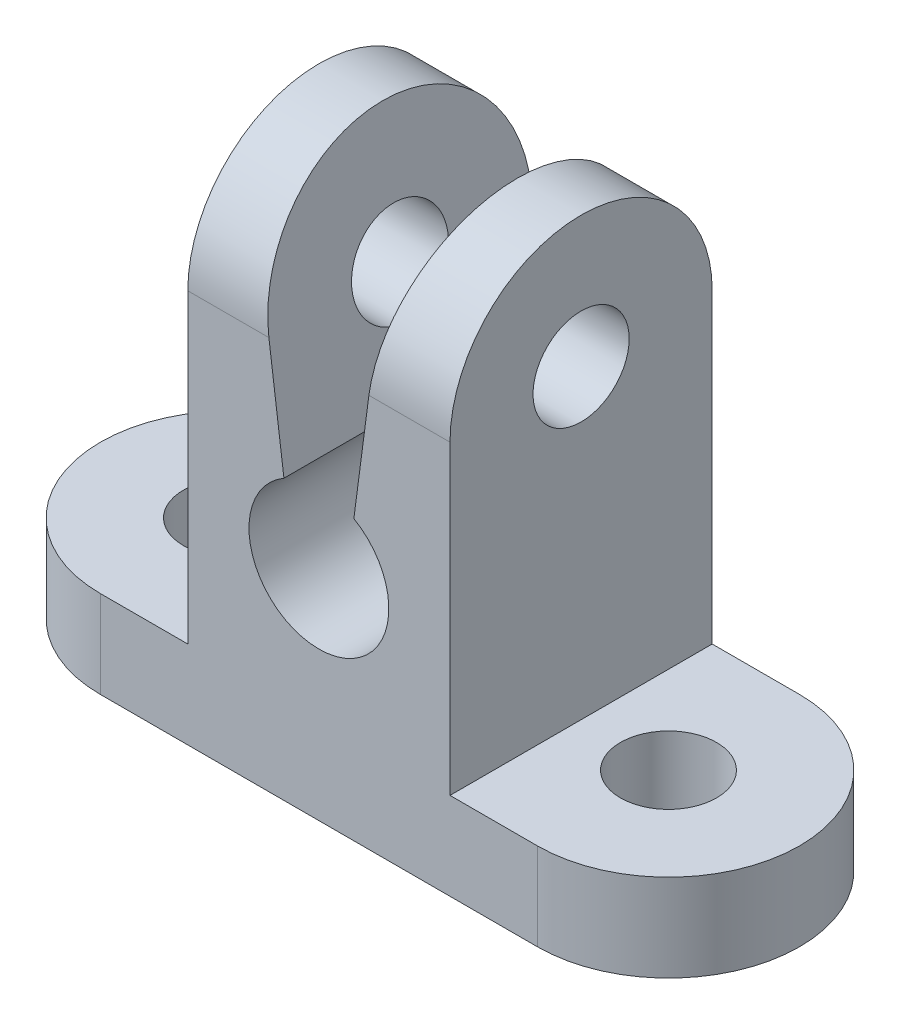
ISO-10303-21;
HEADER;
FILE_DESCRIPTION(('STEP AP214'),'2;1');
FILE_NAME('part.step','',(''),(''),'','','');
FILE_SCHEMA(('AUTOMOTIVE_DESIGN { 1 0 10303 214 1 1 1 1 }'));
ENDSEC;
DATA;
#1=APPLICATION_CONTEXT('core data for automotive mechanical design processes');
#2=APPLICATION_PROTOCOL_DEFINITION('international standard','automotive_design',2000,#1);
#3=PRODUCT_CONTEXT('',#1,'mechanical');
#4=PRODUCT('Part','Part','',(#3));
#5=PRODUCT_RELATED_PRODUCT_CATEGORY('part','',(#4));
#6=PRODUCT_DEFINITION_FORMATION('','',#4);
#7=PRODUCT_DEFINITION_CONTEXT('part definition',#1,'design');
#8=PRODUCT_DEFINITION('design','',#6,#7);
#9=PRODUCT_DEFINITION_SHAPE('','',#8);
#10=(LENGTH_UNIT() NAMED_UNIT(*) SI_UNIT(.MILLI.,.METRE.));
#11=(NAMED_UNIT(*) PLANE_ANGLE_UNIT() SI_UNIT($,.RADIAN.));
#12=(NAMED_UNIT(*) SI_UNIT($,.STERADIAN.) SOLID_ANGLE_UNIT());
#13=UNCERTAINTY_MEASURE_WITH_UNIT(LENGTH_MEASURE(1.E-05),#10,'distance_accuracy_value','');
#14=(GEOMETRIC_REPRESENTATION_CONTEXT(3) GLOBAL_UNCERTAINTY_ASSIGNED_CONTEXT((#13)) GLOBAL_UNIT_ASSIGNED_CONTEXT((#10,
#11,#12)) REPRESENTATION_CONTEXT('',''));
#15=CARTESIAN_POINT('',(0.,0.,0.));
#16=DIRECTION('',(0.,0.,1.));
#17=DIRECTION('',(1.,0.,0.));
#18=AXIS2_PLACEMENT_3D('',#15,#16,#17);
#19=CARTESIAN_POINT('',(-3.,9.,0.));
#20=DIRECTION('',(-1.,0.,0.));
#21=DIRECTION('',(0.,0.,1.));
#22=AXIS2_PLACEMENT_3D('',#19,#20,#21);
#23=CYLINDRICAL_SURFACE('',#22,3.);
#24=DIRECTION('',(-1.,0.,0.));
#25=VECTOR('',#24,1.);
#26=CARTESIAN_POINT('',(-5.,9.,-3.));
#27=LINE('',#26,#25);
#28=CARTESIAN_POINT('',(1.14418693853782,9.,-3.));
#29=VERTEX_POINT('',#28);
#30=CARTESIAN_POINT('',(3.,9.,-3.));
#31=VERTEX_POINT('',#30);
#32=EDGE_CURVE('E214',#29,#31,#27,.F.);
#33=ORIENTED_EDGE('',*,*,#32,.F.);
#34=CARTESIAN_POINT('',(1.14418693853782,9.,0.));
#35=DIRECTION('',(-0.99144486137381,0.130526192220053,0.));
#36=DIRECTION('',(-0.130526192220053,-0.99144486137381,0.));
#37=AXIS2_PLACEMENT_3D('',#34,#35,#36);
#38=ELLIPSE('',#37,3.02588688174046,3.);
#39=CARTESIAN_POINT('',(1.14418693853782,9.,3.));
#40=VERTEX_POINT('',#39);
#41=EDGE_CURVE('E141',#29,#40,#38,.F.);
#42=ORIENTED_EDGE('',*,*,#41,.T.);
#43=DIRECTION('',(-1.,0.,0.));
#44=VECTOR('',#43,1.);
#45=CARTESIAN_POINT('',(-5.,9.,3.));
#46=LINE('',#45,#44);
#47=CARTESIAN_POINT('',(3.,9.,3.));
#48=VERTEX_POINT('',#47);
#49=EDGE_CURVE('E217',#48,#40,#46,.T.);
#50=ORIENTED_EDGE('',*,*,#49,.F.);
#51=CARTESIAN_POINT('',(3.,9.,0.));
#52=DIRECTION('',(-1.,0.,0.));
#53=DIRECTION('',(0.,0.,1.));
#54=AXIS2_PLACEMENT_3D('',#51,#52,#53);
#55=CIRCLE('',#54,3.);
#56=EDGE_CURVE('E11',#31,#48,#55,.F.);
#57=ORIENTED_EDGE('',*,*,#56,.F.);
#58=EDGE_LOOP('',(#33,#42,#50,#57));
#59=FACE_BOUND('',#58,.T.);
#60=ADVANCED_FACE('F36',(#59),#23,.T.);
#61=CARTESIAN_POINT('',(-5.,2.,3.));
#62=DIRECTION('',(0.,0.,-1.));
#63=DIRECTION('',(-1.,0.,0.));
#64=AXIS2_PLACEMENT_3D('',#61,#62,#63);
#65=PLANE('',#64);
#66=DIRECTION('',(0.130526192220053,0.99144486137381,0.));
#67=VECTOR('',#66,1.);
#68=CARTESIAN_POINT('',(0.1336412341509,1.32414330980639,3.));
#69=LINE('',#68,#67);
#70=CARTESIAN_POINT('',(0.8,6.3856406460551,3.));
#71=VERTEX_POINT('',#70);
#72=EDGE_CURVE('E161',#71,#40,#69,.T.);
#73=ORIENTED_EDGE('',*,*,#72,.F.);
#74=CARTESIAN_POINT('',(0.,5.,3.));
#75=DIRECTION('',(0.,0.,-1.));
#76=DIRECTION('',(-1.,0.,0.));
#77=AXIS2_PLACEMENT_3D('',#74,#75,#76);
#78=CIRCLE('',#77,1.6);
#79=CARTESIAN_POINT('',(-0.8,6.3856406460551,3.));
#80=VERTEX_POINT('',#79);
#81=EDGE_CURVE('E131',#71,#80,#78,.T.);
#82=ORIENTED_EDGE('',*,*,#81,.T.);
#83=DIRECTION('',(-0.130526192220053,0.99144486137381,0.));
#84=VECTOR('',#83,1.);
#85=CARTESIAN_POINT('',(-0.304012102705562,2.618238535319,3.));
#86=LINE('',#85,#84);
#87=CARTESIAN_POINT('',(-1.14418693853782,9.,3.));
#88=VERTEX_POINT('',#87);
#89=EDGE_CURVE('E134',#80,#88,#86,.T.);
#90=ORIENTED_EDGE('',*,*,#89,.T.);
#91=CARTESIAN_POINT('',(-3.,9.,3.));
#92=VERTEX_POINT('',#91);
#93=EDGE_CURVE('E62',#88,#92,#46,.T.);
#94=ORIENTED_EDGE('',*,*,#93,.T.);
#95=DIRECTION('',(0.,-1.,0.));
#96=VECTOR('',#95,1.);
#97=CARTESIAN_POINT('',(-3.,0.,3.));
#98=LINE('',#97,#96);
#99=CARTESIAN_POINT('',(-3.,2.,3.));
#100=VERTEX_POINT('',#99);
#101=EDGE_CURVE('E165',#92,#100,#98,.T.);
#102=ORIENTED_EDGE('',*,*,#101,.T.);
#103=DIRECTION('',(1.,0.,0.));
#104=VECTOR('',#103,1.);
#105=CARTESIAN_POINT('',(-5.,2.,3.));
#106=LINE('',#105,#104);
#107=CARTESIAN_POINT('',(-5.,2.,3.));
#108=VERTEX_POINT('',#107);
#109=EDGE_CURVE('E187',#108,#100,#106,.T.);
#110=ORIENTED_EDGE('',*,*,#109,.F.);
#111=DIRECTION('',(0.,-1.,0.));
#112=VECTOR('',#111,1.);
#113=CARTESIAN_POINT('',(-5.,2.,3.));
#114=LINE('',#113,#112);
#115=CARTESIAN_POINT('',(-5.,0.,3.));
#116=VERTEX_POINT('',#115);
#117=EDGE_CURVE('E211',#108,#116,#114,.T.);
#118=ORIENTED_EDGE('',*,*,#117,.T.);
#119=DIRECTION('',(1.,0.,0.));
#120=VECTOR('',#119,1.);
#121=CARTESIAN_POINT('',(-5.,0.,3.));
#122=LINE('',#121,#120);
#123=CARTESIAN_POINT('',(5.,0.,3.));
#124=VERTEX_POINT('',#123);
#125=EDGE_CURVE('E198',#116,#124,#122,.T.);
#126=ORIENTED_EDGE('',*,*,#125,.T.);
#127=DIRECTION('',(0.,-1.,0.));
#128=VECTOR('',#127,1.);
#129=CARTESIAN_POINT('',(5.,2.,3.));
#130=LINE('',#129,#128);
#131=CARTESIAN_POINT('',(5.,2.,3.));
#132=VERTEX_POINT('',#131);
#133=EDGE_CURVE('E208',#132,#124,#130,.T.);
#134=ORIENTED_EDGE('',*,*,#133,.F.);
#135=CARTESIAN_POINT('',(3.,2.,3.));
#136=VERTEX_POINT('',#135);
#137=EDGE_CURVE('E185',#136,#132,#106,.T.);
#138=ORIENTED_EDGE('',*,*,#137,.F.);
#139=DIRECTION('',(0.,-1.,0.));
#140=VECTOR('',#139,1.);
#141=CARTESIAN_POINT('',(3.,0.,3.));
#142=LINE('',#141,#140);
#143=EDGE_CURVE('E166',#48,#136,#142,.T.);
#144=ORIENTED_EDGE('',*,*,#143,.F.);
#145=ORIENTED_EDGE('',*,*,#49,.T.);
#146=EDGE_LOOP('',(#73,#82,#90,#94,#102,#110,#118,#126,#134,#138,#144,#145));
#147=FACE_BOUND('',#146,.T.);
#148=ADVANCED_FACE('F263',(#147),#65,.F.);
#149=CARTESIAN_POINT('',(-5.,2.,-3.));
#150=DIRECTION('',(0.,0.,1.));
#151=DIRECTION('',(1.,0.,0.));
#152=AXIS2_PLACEMENT_3D('',#149,#150,#151);
#153=PLANE('',#152);
#154=DIRECTION('',(0.130526192220053,0.99144486137381,0.));
#155=VECTOR('',#154,1.);
#156=CARTESIAN_POINT('',(-0.0399923766742916,0.00526509627362644,-3.));
#157=LINE('',#156,#155);
#158=CARTESIAN_POINT('',(0.8,6.3856406460551,-3.));
#159=VERTEX_POINT('',#158);
#160=EDGE_CURVE('E138',#159,#29,#157,.T.);
#161=ORIENTED_EDGE('',*,*,#160,.T.);
#162=ORIENTED_EDGE('',*,*,#32,.T.);
#163=DIRECTION('',(0.,1.,0.));
#164=VECTOR('',#163,1.);
#165=CARTESIAN_POINT('',(3.,0.,-3.));
#166=LINE('',#165,#164);
#167=CARTESIAN_POINT('',(3.,2.,-3.));
#168=VERTEX_POINT('',#167);
#169=EDGE_CURVE('E168',#168,#31,#166,.T.);
#170=ORIENTED_EDGE('',*,*,#169,.F.);
#171=DIRECTION('',(-1.,0.,0.));
#172=VECTOR('',#171,1.);
#173=CARTESIAN_POINT('',(-5.,2.,-3.));
#174=LINE('',#173,#172);
#175=CARTESIAN_POINT('',(5.,2.,-3.));
#176=VERTEX_POINT('',#175);
#177=EDGE_CURVE('E193',#176,#168,#174,.T.);
#178=ORIENTED_EDGE('',*,*,#177,.F.);
#179=DIRECTION('',(0.,-1.,0.));
#180=VECTOR('',#179,1.);
#181=CARTESIAN_POINT('',(5.,2.,-3.));
#182=LINE('',#181,#180);
#183=CARTESIAN_POINT('',(5.,0.,-3.));
#184=VERTEX_POINT('',#183);
#185=EDGE_CURVE('E205',#176,#184,#182,.T.);
#186=ORIENTED_EDGE('',*,*,#185,.T.);
#187=DIRECTION('',(-1.,0.,0.));
#188=VECTOR('',#187,1.);
#189=CARTESIAN_POINT('',(-5.,0.,-3.));
#190=LINE('',#189,#188);
#191=CARTESIAN_POINT('',(-5.,0.,-3.));
#192=VERTEX_POINT('',#191);
#193=EDGE_CURVE('E186',#184,#192,#190,.T.);
#194=ORIENTED_EDGE('',*,*,#193,.T.);
#195=DIRECTION('',(0.,-1.,0.));
#196=VECTOR('',#195,1.);
#197=CARTESIAN_POINT('',(-5.,2.,-3.));
#198=LINE('',#197,#196);
#199=CARTESIAN_POINT('',(-5.,2.,-3.));
#200=VERTEX_POINT('',#199);
#201=EDGE_CURVE('E195',#200,#192,#198,.T.);
#202=ORIENTED_EDGE('',*,*,#201,.F.);
#203=CARTESIAN_POINT('',(-3.,2.,-3.));
#204=VERTEX_POINT('',#203);
#205=EDGE_CURVE('E192',#204,#200,#174,.T.);
#206=ORIENTED_EDGE('',*,*,#205,.F.);
#207=DIRECTION('',(0.,1.,0.));
#208=VECTOR('',#207,1.);
#209=CARTESIAN_POINT('',(-3.,0.,-3.));
#210=LINE('',#209,#208);
#211=CARTESIAN_POINT('',(-3.,9.,-3.));
#212=VERTEX_POINT('',#211);
#213=EDGE_CURVE('E169',#204,#212,#210,.T.);
#214=ORIENTED_EDGE('',*,*,#213,.T.);
#215=CARTESIAN_POINT('',(-1.14418693853782,9.,-3.));
#216=VERTEX_POINT('',#215);
#217=EDGE_CURVE('E215',#212,#216,#27,.F.);
#218=ORIENTED_EDGE('',*,*,#217,.T.);
#219=DIRECTION('',(-0.130526192220053,0.99144486137381,0.));
#220=VECTOR('',#219,1.);
#221=CARTESIAN_POINT('',(0.0399923766742916,0.00526509627362644,-3.));
#222=LINE('',#221,#220);
#223=CARTESIAN_POINT('',(-0.8,6.3856406460551,-3.));
#224=VERTEX_POINT('',#223);
#225=EDGE_CURVE('E144',#224,#216,#222,.T.);
#226=ORIENTED_EDGE('',*,*,#225,.F.);
#227=CARTESIAN_POINT('',(0.,5.,-3.));
#228=DIRECTION('',(0.,0.,-1.));
#229=DIRECTION('',(-1.,0.,0.));
#230=AXIS2_PLACEMENT_3D('',#227,#228,#229);
#231=CIRCLE('',#230,1.6);
#232=EDGE_CURVE('E54',#159,#224,#231,.T.);
#233=ORIENTED_EDGE('',*,*,#232,.F.);
#234=EDGE_LOOP('',(#161,#162,#170,#178,#186,#194,#202,#206,#214,#218,#226,#233));
#235=FACE_BOUND('',#234,.T.);
#236=ADVANCED_FACE('F147',(#235),#153,.F.);
#237=CARTESIAN_POINT('',(-1.14418693853782,9.,0.));
#238=DIRECTION('',(-0.99144486137381,-0.130526192220053,0.));
#239=DIRECTION('',(-0.130526192220053,0.99144486137381,0.));
#240=AXIS2_PLACEMENT_3D('',#237,#238,#239);
#241=ELLIPSE('',#240,3.02588688174046,3.);
#242=EDGE_CURVE('E159',#216,#88,#241,.F.);
#243=ORIENTED_EDGE('',*,*,#242,.F.);
#244=ORIENTED_EDGE('',*,*,#217,.F.);
#245=CARTESIAN_POINT('',(-3.,9.,0.));
#246=DIRECTION('',(-1.,0.,0.));
#247=DIRECTION('',(0.,0.,1.));
#248=AXIS2_PLACEMENT_3D('',#245,#246,#247);
#249=CIRCLE('',#248,3.);
#250=EDGE_CURVE('E46',#92,#212,#249,.T.);
#251=ORIENTED_EDGE('',*,*,#250,.F.);
#252=ORIENTED_EDGE('',*,*,#93,.F.);
#253=EDGE_LOOP('',(#243,#244,#251,#252));
#254=FACE_BOUND('',#253,.T.);
#255=ADVANCED_FACE('F39',(#254),#23,.T.);
#256=CARTESIAN_POINT('',(-5.,2.,0.));
#257=DIRECTION('',(0.,1.,0.));
#258=DIRECTION('',(0.,0.,1.));
#259=AXIS2_PLACEMENT_3D('',#256,#257,#258);
#260=PLANE('',#259);
#261=CARTESIAN_POINT('',(5.,2.,0.));
#262=DIRECTION('',(0.,1.,0.));
#263=DIRECTION('',(0.,0.,1.));
#264=AXIS2_PLACEMENT_3D('',#261,#262,#263);
#265=CIRCLE('',#264,1.1);
#266=CARTESIAN_POINT('',(5.,2.,1.1));
#267=VERTEX_POINT('',#266);
#268=EDGE_CURVE('E226',#267,#267,#265,.T.);
#269=ORIENTED_EDGE('',*,*,#268,.F.);
#270=EDGE_LOOP('',(#269));
#271=FACE_BOUND('',#270,.T.);
#272=ORIENTED_EDGE('',*,*,#177,.T.);
#273=DIRECTION('',(0.,0.,1.));
#274=VECTOR('',#273,1.);
#275=CARTESIAN_POINT('',(3.,2.,0.));
#276=LINE('',#275,#274);
#277=EDGE_CURVE('E178',#168,#136,#276,.T.);
#278=ORIENTED_EDGE('',*,*,#277,.T.);
#279=ORIENTED_EDGE('',*,*,#137,.T.);
#280=CARTESIAN_POINT('',(5.,2.,0.));
#281=DIRECTION('',(0.,1.,0.));
#282=DIRECTION('',(0.,0.,1.));
#283=AXIS2_PLACEMENT_3D('',#280,#281,#282);
#284=CIRCLE('',#283,3.);
#285=EDGE_CURVE('E190',#132,#176,#284,.T.);
#286=ORIENTED_EDGE('',*,*,#285,.T.);
#287=EDGE_LOOP('',(#272,#278,#279,#286));
#288=FACE_BOUND('',#287,.T.);
#289=ADVANCED_FACE('F270',(#271,#288),#260,.T.);
#290=CARTESIAN_POINT('',(-5.,2.,0.));
#291=DIRECTION('',(0.,-1.,0.));
#292=DIRECTION('',(0.,0.,-1.));
#293=AXIS2_PLACEMENT_3D('',#290,#291,#292);
#294=CYLINDRICAL_SURFACE('',#293,3.);
#295=CARTESIAN_POINT('',(-5.,0.,0.));
#296=DIRECTION('',(0.,1.,0.));
#297=DIRECTION('',(0.,0.,1.));
#298=AXIS2_PLACEMENT_3D('',#295,#296,#297);
#299=CIRCLE('',#298,3.);
#300=EDGE_CURVE('E181',#192,#116,#299,.T.);
#301=ORIENTED_EDGE('',*,*,#300,.T.);
#302=ORIENTED_EDGE('',*,*,#117,.F.);
#303=CARTESIAN_POINT('',(-5.,2.,0.));
#304=DIRECTION('',(0.,1.,0.));
#305=DIRECTION('',(0.,0.,1.));
#306=AXIS2_PLACEMENT_3D('',#303,#304,#305);
#307=CIRCLE('',#306,3.);
#308=EDGE_CURVE('E182',#200,#108,#307,.T.);
#309=ORIENTED_EDGE('',*,*,#308,.F.);
#310=ORIENTED_EDGE('',*,*,#201,.T.);
#311=EDGE_LOOP('',(#301,#302,#309,#310));
#312=FACE_BOUND('',#311,.T.);
#313=ADVANCED_FACE('F276',(#312),#294,.T.);
#314=CARTESIAN_POINT('',(5.,2.,0.));
#315=DIRECTION('',(0.,-1.,0.));
#316=DIRECTION('',(0.,0.,-1.));
#317=AXIS2_PLACEMENT_3D('',#314,#315,#316);
#318=CYLINDRICAL_SURFACE('',#317,3.);
#319=CARTESIAN_POINT('',(5.,0.,0.));
#320=DIRECTION('',(0.,1.,0.));
#321=DIRECTION('',(0.,0.,1.));
#322=AXIS2_PLACEMENT_3D('',#319,#320,#321);
#323=CIRCLE('',#322,3.);
#324=EDGE_CURVE('E200',#124,#184,#323,.T.);
#325=ORIENTED_EDGE('',*,*,#324,.T.);
#326=ORIENTED_EDGE('',*,*,#185,.F.);
#327=ORIENTED_EDGE('',*,*,#285,.F.);
#328=ORIENTED_EDGE('',*,*,#133,.T.);
#329=EDGE_LOOP('',(#325,#326,#327,#328));
#330=FACE_BOUND('',#329,.T.);
#331=ADVANCED_FACE('F300',(#330),#318,.T.);
#332=CARTESIAN_POINT('',(-5.,2.,0.));
#333=DIRECTION('',(0.,1.,0.));
#334=DIRECTION('',(0.,0.,1.));
#335=AXIS2_PLACEMENT_3D('',#332,#333,#334);
#336=CIRCLE('',#335,1.1);
#337=CARTESIAN_POINT('',(-5.,2.,1.1));
#338=VERTEX_POINT('',#337);
#339=EDGE_CURVE('E231',#338,#338,#336,.T.);
#340=ORIENTED_EDGE('',*,*,#339,.F.);
#341=EDGE_LOOP('',(#340));
#342=FACE_BOUND('',#341,.T.);
#343=DIRECTION('',(0.,0.,1.));
#344=VECTOR('',#343,1.);
#345=CARTESIAN_POINT('',(-3.,2.,0.));
#346=LINE('',#345,#344);
#347=EDGE_CURVE('E172',#204,#100,#346,.T.);
#348=ORIENTED_EDGE('',*,*,#347,.F.);
#349=ORIENTED_EDGE('',*,*,#205,.T.);
#350=ORIENTED_EDGE('',*,*,#308,.T.);
#351=ORIENTED_EDGE('',*,*,#109,.T.);
#352=EDGE_LOOP('',(#348,#349,#350,#351));
#353=FACE_BOUND('',#352,.T.);
#354=ADVANCED_FACE('F279',(#342,#353),#260,.T.);
#355=CARTESIAN_POINT('',(-5.,0.,0.));
#356=DIRECTION('',(0.,1.,0.));
#357=DIRECTION('',(0.,0.,1.));
#358=AXIS2_PLACEMENT_3D('',#355,#356,#357);
#359=PLANE('',#358);
#360=CARTESIAN_POINT('',(0.,0.,0.));
#361=DIRECTION('',(0.,-1.,0.));
#362=DIRECTION('',(0.,0.,-1.));
#363=AXIS2_PLACEMENT_3D('',#360,#361,#362);
#364=CIRCLE('',#363,1.5);
#365=CARTESIAN_POINT('',(0.,0.,-1.5));
#366=VERTEX_POINT('',#365);
#367=EDGE_CURVE('E239',#366,#366,#364,.T.);
#368=ORIENTED_EDGE('',*,*,#367,.F.);
#369=EDGE_LOOP('',(#368));
#370=FACE_BOUND('',#369,.T.);
#371=CARTESIAN_POINT('',(5.,0.,0.));
#372=DIRECTION('',(0.,1.,0.));
#373=DIRECTION('',(0.,0.,1.));
#374=AXIS2_PLACEMENT_3D('',#371,#372,#373);
#375=CIRCLE('',#374,1.1);
#376=CARTESIAN_POINT('',(5.,0.,1.1));
#377=VERTEX_POINT('',#376);
#378=EDGE_CURVE('E41',#377,#377,#375,.T.);
#379=ORIENTED_EDGE('',*,*,#378,.T.);
#380=EDGE_LOOP('',(#379));
#381=FACE_BOUND('',#380,.T.);
#382=CARTESIAN_POINT('',(-5.,0.,0.));
#383=DIRECTION('',(0.,1.,0.));
#384=DIRECTION('',(0.,0.,1.));
#385=AXIS2_PLACEMENT_3D('',#382,#383,#384);
#386=CIRCLE('',#385,1.1);
#387=CARTESIAN_POINT('',(-5.,0.,1.1));
#388=VERTEX_POINT('',#387);
#389=EDGE_CURVE('E224',#388,#388,#386,.T.);
#390=ORIENTED_EDGE('',*,*,#389,.T.);
#391=EDGE_LOOP('',(#390));
#392=FACE_BOUND('',#391,.T.);
#393=ORIENTED_EDGE('',*,*,#300,.F.);
#394=ORIENTED_EDGE('',*,*,#193,.F.);
#395=ORIENTED_EDGE('',*,*,#324,.F.);
#396=ORIENTED_EDGE('',*,*,#125,.F.);
#397=EDGE_LOOP('',(#393,#394,#395,#396));
#398=FACE_BOUND('',#397,.T.);
#399=ADVANCED_FACE('F303',(#370,#381,#392,#398),#359,.F.);
#400=CARTESIAN_POINT('',(3.,0.,0.));
#401=DIRECTION('',(-1.,0.,0.));
#402=DIRECTION('',(0.,0.,1.));
#403=AXIS2_PLACEMENT_3D('',#400,#401,#402);
#404=PLANE('',#403);
#405=CARTESIAN_POINT('',(3.,9.,0.));
#406=DIRECTION('',(1.,0.,0.));
#407=DIRECTION('',(0.,0.,-1.));
#408=AXIS2_PLACEMENT_3D('',#405,#406,#407);
#409=CIRCLE('',#408,1.1);
#410=CARTESIAN_POINT('',(3.,9.,-1.1));
#411=VERTEX_POINT('',#410);
#412=EDGE_CURVE('E223',#411,#411,#409,.T.);
#413=ORIENTED_EDGE('',*,*,#412,.F.);
#414=EDGE_LOOP('',(#413));
#415=FACE_BOUND('',#414,.T.);
#416=ORIENTED_EDGE('',*,*,#169,.T.);
#417=ORIENTED_EDGE('',*,*,#56,.T.);
#418=ORIENTED_EDGE('',*,*,#143,.T.);
#419=ORIENTED_EDGE('',*,*,#277,.F.);
#420=EDGE_LOOP('',(#416,#417,#418,#419));
#421=FACE_BOUND('',#420,.T.);
#422=ADVANCED_FACE('F309',(#415,#421),#404,.F.);
#423=CARTESIAN_POINT('',(-3.,0.,0.));
#424=DIRECTION('',(-1.,0.,0.));
#425=DIRECTION('',(0.,0.,1.));
#426=AXIS2_PLACEMENT_3D('',#423,#424,#425);
#427=PLANE('',#426);
#428=CARTESIAN_POINT('',(-3.,9.,0.));
#429=DIRECTION('',(-1.,0.,0.));
#430=DIRECTION('',(0.,0.,1.));
#431=AXIS2_PLACEMENT_3D('',#428,#429,#430);
#432=CIRCLE('',#431,1.1);
#433=CARTESIAN_POINT('',(-3.,9.,1.1));
#434=VERTEX_POINT('',#433);
#435=EDGE_CURVE('E149',#434,#434,#432,.T.);
#436=ORIENTED_EDGE('',*,*,#435,.F.);
#437=EDGE_LOOP('',(#436));
#438=FACE_BOUND('',#437,.T.);
#439=ORIENTED_EDGE('',*,*,#101,.F.);
#440=ORIENTED_EDGE('',*,*,#250,.T.);
#441=ORIENTED_EDGE('',*,*,#213,.F.);
#442=ORIENTED_EDGE('',*,*,#347,.T.);
#443=EDGE_LOOP('',(#439,#440,#441,#442));
#444=FACE_BOUND('',#443,.T.);
#445=ADVANCED_FACE('F259',(#438,#444),#427,.T.);
#446=CARTESIAN_POINT('',(0.,5.,25.));
#447=DIRECTION('',(0.,0.,-1.));
#448=DIRECTION('',(-1.,0.,0.));
#449=AXIS2_PLACEMENT_3D('',#446,#447,#448);
#450=CYLINDRICAL_SURFACE('',#449,1.6);
#451=DIRECTION('',(0.,0.,-1.));
#452=VECTOR('',#451,1.);
#453=CARTESIAN_POINT('',(0.8,6.3856406460551,25.));
#454=LINE('',#453,#452);
#455=EDGE_CURVE('E127',#71,#159,#454,.T.);
#456=ORIENTED_EDGE('',*,*,#455,.T.);
#457=ORIENTED_EDGE('',*,*,#232,.T.);
#458=DIRECTION('',(0.,0.,-1.));
#459=VECTOR('',#458,1.);
#460=CARTESIAN_POINT('',(-0.8,6.3856406460551,25.));
#461=LINE('',#460,#459);
#462=EDGE_CURVE('E135',#80,#224,#461,.T.);
#463=ORIENTED_EDGE('',*,*,#462,.F.);
#464=ORIENTED_EDGE('',*,*,#81,.F.);
#465=EDGE_LOOP('',(#456,#457,#463,#464));
#466=FACE_BOUND('',#465,.T.);
#467=ADVANCED_FACE('F129',(#466),#450,.F.);
#468=CARTESIAN_POINT('',(-0.0399923766742916,0.00526509627362644,25.));
#469=DIRECTION('',(-0.99144486137381,0.130526192220053,0.));
#470=DIRECTION('',(-0.130526192220053,-0.99144486137381,0.));
#471=AXIS2_PLACEMENT_3D('',#468,#469,#470);
#472=PLANE('',#471);
#473=CARTESIAN_POINT('',(1.14418693853782,9.,0.));
#474=DIRECTION('',(-0.99144486137381,0.130526192220053,0.));
#475=DIRECTION('',(0.130526192220053,0.99144486137381,0.));
#476=AXIS2_PLACEMENT_3D('',#473,#474,#475);
#477=ELLIPSE('',#476,1.10949185663817,1.1);
#478=CARTESIAN_POINT('',(1.28900468588396,10.1,0.));
#479=VERTEX_POINT('',#478);
#480=EDGE_CURVE('E153',#479,#479,#477,.T.);
#481=ORIENTED_EDGE('',*,*,#480,.F.);
#482=EDGE_LOOP('',(#481));
#483=FACE_BOUND('',#482,.T.);
#484=ORIENTED_EDGE('',*,*,#160,.F.);
#485=ORIENTED_EDGE('',*,*,#455,.F.);
#486=ORIENTED_EDGE('',*,*,#72,.T.);
#487=ORIENTED_EDGE('',*,*,#41,.F.);
#488=EDGE_LOOP('',(#484,#485,#486,#487));
#489=FACE_BOUND('',#488,.T.);
#490=ADVANCED_FACE('F139',(#483,#489),#472,.T.);
#491=CARTESIAN_POINT('',(0.0399923766742916,0.00526509627362644,25.));
#492=DIRECTION('',(-0.99144486137381,-0.130526192220053,0.));
#493=DIRECTION('',(0.130526192220053,-0.99144486137381,0.));
#494=AXIS2_PLACEMENT_3D('',#491,#492,#493);
#495=PLANE('',#494);
#496=CARTESIAN_POINT('',(-1.14418693853782,9.,0.));
#497=DIRECTION('',(-0.99144486137381,-0.130526192220053,0.));
#498=DIRECTION('',(0.130526192220053,-0.99144486137381,0.));
#499=AXIS2_PLACEMENT_3D('',#496,#497,#498);
#500=ELLIPSE('',#499,1.10949185663817,1.1);
#501=CARTESIAN_POINT('',(-0.999369191191686,7.9,0.));
#502=VERTEX_POINT('',#501);
#503=EDGE_CURVE('E221',#502,#502,#500,.T.);
#504=ORIENTED_EDGE('',*,*,#503,.T.);
#505=EDGE_LOOP('',(#504));
#506=FACE_BOUND('',#505,.T.);
#507=ORIENTED_EDGE('',*,*,#242,.T.);
#508=ORIENTED_EDGE('',*,*,#89,.F.);
#509=ORIENTED_EDGE('',*,*,#462,.T.);
#510=ORIENTED_EDGE('',*,*,#225,.T.);
#511=EDGE_LOOP('',(#507,#508,#509,#510));
#512=FACE_BOUND('',#511,.T.);
#513=ADVANCED_FACE('F250',(#506,#512),#495,.F.);
#514=CARTESIAN_POINT('',(-25.,9.,0.));
#515=DIRECTION('',(1.,0.,0.));
#516=DIRECTION('',(0.,0.,-1.));
#517=AXIS2_PLACEMENT_3D('',#514,#515,#516);
#518=CYLINDRICAL_SURFACE('',#517,1.1);
#519=ORIENTED_EDGE('',*,*,#435,.T.);
#520=EDGE_LOOP('',(#519));
#521=FACE_BOUND('',#520,.T.);
#522=ORIENTED_EDGE('',*,*,#503,.F.);
#523=EDGE_LOOP('',(#522));
#524=FACE_BOUND('',#523,.T.);
#525=ADVANCED_FACE('F256',(#521,#524),#518,.F.);
#526=ORIENTED_EDGE('',*,*,#480,.T.);
#527=EDGE_LOOP('',(#526));
#528=FACE_BOUND('',#527,.T.);
#529=ORIENTED_EDGE('',*,*,#412,.T.);
#530=EDGE_LOOP('',(#529));
#531=FACE_BOUND('',#530,.T.);
#532=ADVANCED_FACE('F246',(#528,#531),#518,.F.);
#533=CARTESIAN_POINT('',(-5.,-1.5,0.));
#534=DIRECTION('',(0.,1.,0.));
#535=DIRECTION('',(0.,0.,1.));
#536=AXIS2_PLACEMENT_3D('',#533,#534,#535);
#537=CYLINDRICAL_SURFACE('',#536,1.1);
#538=ORIENTED_EDGE('',*,*,#339,.T.);
#539=EDGE_LOOP('',(#538));
#540=FACE_BOUND('',#539,.T.);
#541=ORIENTED_EDGE('',*,*,#389,.F.);
#542=EDGE_LOOP('',(#541));
#543=FACE_BOUND('',#542,.T.);
#544=ADVANCED_FACE('F380',(#540,#543),#537,.F.);
#545=CARTESIAN_POINT('',(5.,-1.5,0.));
#546=DIRECTION('',(0.,1.,0.));
#547=DIRECTION('',(0.,0.,1.));
#548=AXIS2_PLACEMENT_3D('',#545,#546,#547);
#549=CYLINDRICAL_SURFACE('',#548,1.1);
#550=ORIENTED_EDGE('',*,*,#268,.T.);
#551=EDGE_LOOP('',(#550));
#552=FACE_BOUND('',#551,.T.);
#553=ORIENTED_EDGE('',*,*,#378,.F.);
#554=EDGE_LOOP('',(#553));
#555=FACE_BOUND('',#554,.T.);
#556=ADVANCED_FACE('F354',(#552,#555),#549,.F.);
#557=CARTESIAN_POINT('',(0.,0.1,0.));
#558=DIRECTION('',(0.,-1.,0.));
#559=DIRECTION('',(0.,0.,-1.));
#560=AXIS2_PLACEMENT_3D('',#557,#558,#559);
#561=CYLINDRICAL_SURFACE('',#560,1.5);
#562=CARTESIAN_POINT('',(0.,0.1,0.));
#563=DIRECTION('',(0.,-1.,0.));
#564=DIRECTION('',(0.,0.,-1.));
#565=AXIS2_PLACEMENT_3D('',#562,#563,#564);
#566=CIRCLE('',#565,1.5);
#567=CARTESIAN_POINT('',(0.,0.1,-1.5));
#568=VERTEX_POINT('',#567);
#569=EDGE_CURVE('E236',#568,#568,#566,.T.);
#570=ORIENTED_EDGE('',*,*,#569,.F.);
#571=EDGE_LOOP('',(#570));
#572=FACE_BOUND('',#571,.T.);
#573=ORIENTED_EDGE('',*,*,#367,.T.);
#574=EDGE_LOOP('',(#573));
#575=FACE_BOUND('',#574,.T.);
#576=ADVANCED_FACE('F358',(#572,#575),#561,.F.);
#577=CARTESIAN_POINT('',(0.,0.1,0.));
#578=DIRECTION('',(0.,-1.,0.));
#579=DIRECTION('',(0.,0.,-1.));
#580=AXIS2_PLACEMENT_3D('',#577,#578,#579);
#581=PLANE('',#580);
#582=ORIENTED_EDGE('',*,*,#569,.T.);
#583=EDGE_LOOP('',(#582));
#584=FACE_BOUND('',#583,.T.);
#585=ADVANCED_FACE('F363',(#584),#581,.T.);
#586=CLOSED_SHELL('',(#60,#148,#236,#255,#289,#313,#331,#354,#399,#422,#445,#467,#490,#513,#525,
#532,#544,#556,#576,#585));
#587=MANIFOLD_SOLID_BREP('B2',#586);
#588=ADVANCED_BREP_SHAPE_REPRESENTATION('',(#18,#587),#14);
#589=SHAPE_DEFINITION_REPRESENTATION(#9,#588);
ENDSEC;
END-ISO-10303-21;
